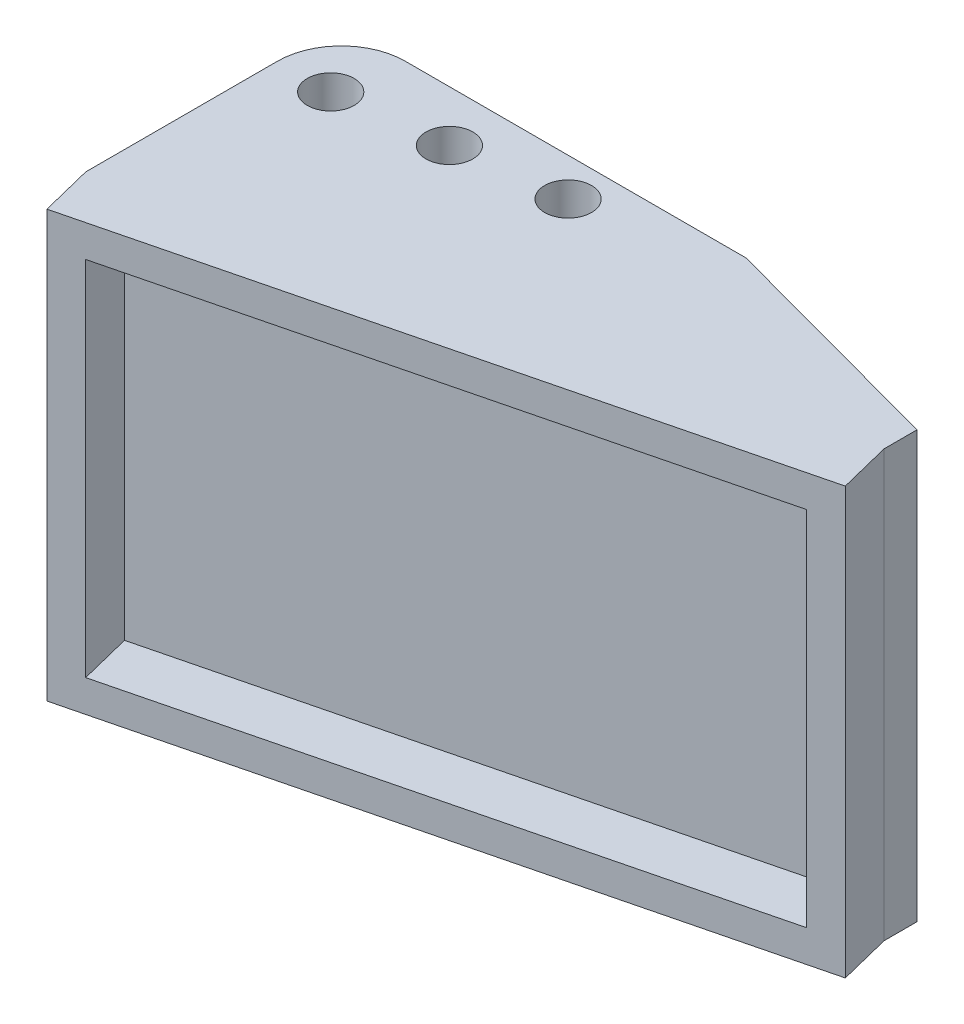
ISO-10303-21;
HEADER;
FILE_DESCRIPTION(('STEP AP214'),'2;1');
FILE_NAME('part.step','',(''),(''),'','','');
FILE_SCHEMA(('AUTOMOTIVE_DESIGN { 1 0 10303 214 1 1 1 1 }'));
ENDSEC;
DATA;
#1=APPLICATION_CONTEXT('core data for automotive mechanical design processes');
#2=APPLICATION_PROTOCOL_DEFINITION('international standard','automotive_design',2000,#1);
#3=PRODUCT_CONTEXT('',#1,'mechanical');
#4=PRODUCT('Part','Part','',(#3));
#5=PRODUCT_RELATED_PRODUCT_CATEGORY('part','',(#4));
#6=PRODUCT_DEFINITION_FORMATION('','',#4);
#7=PRODUCT_DEFINITION_CONTEXT('part definition',#1,'design');
#8=PRODUCT_DEFINITION('design','',#6,#7);
#9=PRODUCT_DEFINITION_SHAPE('','',#8);
#10=(LENGTH_UNIT() NAMED_UNIT(*) SI_UNIT(.MILLI.,.METRE.));
#11=(NAMED_UNIT(*) PLANE_ANGLE_UNIT() SI_UNIT($,.RADIAN.));
#12=(NAMED_UNIT(*) SI_UNIT($,.STERADIAN.) SOLID_ANGLE_UNIT());
#13=UNCERTAINTY_MEASURE_WITH_UNIT(LENGTH_MEASURE(1.E-05),#10,'distance_accuracy_value','');
#14=(GEOMETRIC_REPRESENTATION_CONTEXT(3) GLOBAL_UNCERTAINTY_ASSIGNED_CONTEXT((#13)) GLOBAL_UNIT_ASSIGNED_CONTEXT((#10,
#11,#12)) REPRESENTATION_CONTEXT('',''));
#15=CARTESIAN_POINT('',(0.,0.,0.));
#16=DIRECTION('',(0.,0.,1.));
#17=DIRECTION('',(1.,0.,0.));
#18=AXIS2_PLACEMENT_3D('',#15,#16,#17);
#19=CARTESIAN_POINT('',(-15.,20.,-6.));
#20=DIRECTION('',(0.,0.,1.));
#21=DIRECTION('',(1.,0.,0.));
#22=AXIS2_PLACEMENT_3D('',#19,#20,#21);
#23=PLANE('',#22);
#24=DIRECTION('',(-1.,0.,0.));
#25=VECTOR('',#24,1.);
#26=CARTESIAN_POINT('',(15.,2.45,-6.));
#27=LINE('',#26,#25);
#28=CARTESIAN_POINT('',(4.00000000000001,2.45,-6.));
#29=VERTEX_POINT('',#28);
#30=CARTESIAN_POINT('',(-12.,2.45,-6.));
#31=VERTEX_POINT('',#30);
#32=EDGE_CURVE('E262',#29,#31,#27,.T.);
#33=ORIENTED_EDGE('',*,*,#32,.F.);
#34=DIRECTION('',(0.,1.,0.));
#35=VECTOR('',#34,1.);
#36=CARTESIAN_POINT('',(4.,0.,-6.));
#37=LINE('',#36,#35);
#38=CARTESIAN_POINT('',(4.,0.,-6.));
#39=VERTEX_POINT('',#38);
#40=EDGE_CURVE('E61',#39,#29,#37,.T.);
#41=ORIENTED_EDGE('',*,*,#40,.F.);
#42=DIRECTION('',(-1.,0.,0.));
#43=VECTOR('',#42,1.);
#44=CARTESIAN_POINT('',(-15.,0.,-6.));
#45=LINE('',#44,#43);
#46=CARTESIAN_POINT('',(-12.,0.,-6.));
#47=VERTEX_POINT('',#46);
#48=EDGE_CURVE('E211',#39,#47,#45,.T.);
#49=ORIENTED_EDGE('',*,*,#48,.T.);
#50=DIRECTION('',(0.,-1.,0.));
#51=VECTOR('',#50,1.);
#52=CARTESIAN_POINT('',(-12.,20.,-6.));
#53=LINE('',#52,#51);
#54=EDGE_CURVE('E241',#47,#31,#53,.F.);
#55=ORIENTED_EDGE('',*,*,#54,.T.);
#56=EDGE_LOOP('',(#33,#41,#49,#55));
#57=FACE_BOUND('',#56,.T.);
#58=ADVANCED_FACE('F45',(#57),#23,.F.);
#59=CARTESIAN_POINT('',(-2.57453848358678,0.,-4.21869343405148));
#60=DIRECTION('',(0.,1.,0.));
#61=DIRECTION('',(0.,0.,1.));
#62=AXIS2_PLACEMENT_3D('',#59,#60,#61);
#63=CYLINDRICAL_SURFACE('',#62,1.1);
#64=CARTESIAN_POINT('',(-2.57453848358678,2.45,-4.21869343405148));
#65=DIRECTION('',(0.,-1.,0.));
#66=DIRECTION('',(0.,0.,-1.));
#67=AXIS2_PLACEMENT_3D('',#64,#65,#66);
#68=CIRCLE('',#67,1.1);
#69=CARTESIAN_POINT('',(-2.57453848358678,2.45,-5.31869343405148));
#70=VERTEX_POINT('',#69);
#71=EDGE_CURVE('E278',#70,#70,#68,.F.);
#72=ORIENTED_EDGE('',*,*,#71,.T.);
#73=EDGE_LOOP('',(#72));
#74=FACE_BOUND('',#73,.T.);
#75=CARTESIAN_POINT('',(-2.57453848358678,0.,-4.21869343405148));
#76=DIRECTION('',(0.,1.,0.));
#77=DIRECTION('',(0.,0.,1.));
#78=AXIS2_PLACEMENT_3D('',#75,#76,#77);
#79=CIRCLE('',#78,1.1);
#80=CARTESIAN_POINT('',(-2.57453848358678,0.,-3.11869343405148));
#81=VERTEX_POINT('',#80);
#82=EDGE_CURVE('E273',#81,#81,#79,.T.);
#83=ORIENTED_EDGE('',*,*,#82,.F.);
#84=EDGE_LOOP('',(#83));
#85=FACE_BOUND('',#84,.T.);
#86=ADVANCED_FACE('F444',(#74,#85),#63,.F.);
#87=CARTESIAN_POINT('',(-7.53726924179339,0.,-3.60934671702574));
#88=DIRECTION('',(0.,1.,0.));
#89=DIRECTION('',(0.,0.,1.));
#90=AXIS2_PLACEMENT_3D('',#87,#88,#89);
#91=CYLINDRICAL_SURFACE('',#90,1.1);
#92=CARTESIAN_POINT('',(-7.53726924179339,2.45,-3.60934671702574));
#93=DIRECTION('',(0.,-1.,0.));
#94=DIRECTION('',(0.,0.,-1.));
#95=AXIS2_PLACEMENT_3D('',#92,#93,#94);
#96=CIRCLE('',#95,1.1);
#97=CARTESIAN_POINT('',(-7.53726924179339,2.45,-4.70934671702574));
#98=VERTEX_POINT('',#97);
#99=EDGE_CURVE('E228',#98,#98,#96,.F.);
#100=ORIENTED_EDGE('',*,*,#99,.T.);
#101=EDGE_LOOP('',(#100));
#102=FACE_BOUND('',#101,.T.);
#103=CARTESIAN_POINT('',(-7.53726924179339,0.,-3.60934671702574));
#104=DIRECTION('',(0.,1.,0.));
#105=DIRECTION('',(0.,0.,1.));
#106=AXIS2_PLACEMENT_3D('',#103,#104,#105);
#107=CIRCLE('',#106,1.1);
#108=CARTESIAN_POINT('',(-7.53726924179339,0.,-2.50934671702574));
#109=VERTEX_POINT('',#108);
#110=EDGE_CURVE('E282',#109,#109,#107,.T.);
#111=ORIENTED_EDGE('',*,*,#110,.F.);
#112=EDGE_LOOP('',(#111));
#113=FACE_BOUND('',#112,.T.);
#114=ADVANCED_FACE('F452',(#102,#113),#91,.F.);
#115=CARTESIAN_POINT('',(-12.5,0.,-3.));
#116=DIRECTION('',(0.,1.,0.));
#117=DIRECTION('',(0.,0.,1.));
#118=AXIS2_PLACEMENT_3D('',#115,#116,#117);
#119=CYLINDRICAL_SURFACE('',#118,1.1);
#120=CARTESIAN_POINT('',(-12.5,2.45,-3.));
#121=DIRECTION('',(0.,-1.,0.));
#122=DIRECTION('',(0.,0.,-1.));
#123=AXIS2_PLACEMENT_3D('',#120,#121,#122);
#124=CIRCLE('',#123,1.1);
#125=CARTESIAN_POINT('',(-12.5,2.45,-4.1));
#126=VERTEX_POINT('',#125);
#127=EDGE_CURVE('E224',#126,#126,#124,.F.);
#128=ORIENTED_EDGE('',*,*,#127,.T.);
#129=EDGE_LOOP('',(#128));
#130=FACE_BOUND('',#129,.T.);
#131=CARTESIAN_POINT('',(-12.5,0.,-3.));
#132=DIRECTION('',(0.,1.,0.));
#133=DIRECTION('',(0.,0.,1.));
#134=AXIS2_PLACEMENT_3D('',#131,#132,#133);
#135=CIRCLE('',#134,1.1);
#136=CARTESIAN_POINT('',(-12.5,0.,-1.9));
#137=VERTEX_POINT('',#136);
#138=EDGE_CURVE('E207',#137,#137,#135,.T.);
#139=ORIENTED_EDGE('',*,*,#138,.F.);
#140=EDGE_LOOP('',(#139));
#141=FACE_BOUND('',#140,.T.);
#142=ADVANCED_FACE('F467',(#130,#141),#119,.F.);
#143=CARTESIAN_POINT('',(-15.,20.,-6.));
#144=DIRECTION('',(1.,0.,0.));
#145=DIRECTION('',(0.,0.,-1.));
#146=AXIS2_PLACEMENT_3D('',#143,#144,#145);
#147=PLANE('',#146);
#148=DIRECTION('',(0.,0.,-1.));
#149=VECTOR('',#148,1.);
#150=CARTESIAN_POINT('',(-15.,2.45,34.8141121698799));
#151=LINE('',#150,#149);
#152=CARTESIAN_POINT('',(-15.,2.45,4.45407955597516));
#153=VERTEX_POINT('',#152);
#154=CARTESIAN_POINT('',(-15.,2.45,-3.));
#155=VERTEX_POINT('',#154);
#156=EDGE_CURVE('E309',#153,#155,#151,.T.);
#157=ORIENTED_EDGE('',*,*,#156,.T.);
#158=DIRECTION('',(0.,-1.,0.));
#159=VECTOR('',#158,1.);
#160=CARTESIAN_POINT('',(-15.,20.,-3.));
#161=LINE('',#160,#159);
#162=CARTESIAN_POINT('',(-15.,0.,-3.));
#163=VERTEX_POINT('',#162);
#164=EDGE_CURVE('E233',#155,#163,#161,.T.);
#165=ORIENTED_EDGE('',*,*,#164,.T.);
#166=DIRECTION('',(0.,0.,1.));
#167=VECTOR('',#166,1.);
#168=CARTESIAN_POINT('',(-15.,0.,-6.));
#169=LINE('',#168,#167);
#170=CARTESIAN_POINT('',(-15.,0.,6.));
#171=VERTEX_POINT('',#170);
#172=EDGE_CURVE('E203',#163,#171,#169,.T.);
#173=ORIENTED_EDGE('',*,*,#172,.T.);
#174=DIRECTION('',(0.,-1.,0.));
#175=VECTOR('',#174,1.);
#176=CARTESIAN_POINT('',(-15.,20.,6.));
#177=LINE('',#176,#175);
#178=CARTESIAN_POINT('',(-15.,20.,6.));
#179=VERTEX_POINT('',#178);
#180=EDGE_CURVE('E197',#179,#171,#177,.T.);
#181=ORIENTED_EDGE('',*,*,#180,.F.);
#182=DIRECTION('',(0.,0.,1.));
#183=VECTOR('',#182,1.);
#184=CARTESIAN_POINT('',(-15.,20.,-6.));
#185=LINE('',#184,#183);
#186=CARTESIAN_POINT('',(-15.,20.,-3.));
#187=VERTEX_POINT('',#186);
#188=EDGE_CURVE('E199',#187,#179,#185,.T.);
#189=ORIENTED_EDGE('',*,*,#188,.F.);
#190=DIRECTION('',(0.,-1.,0.));
#191=VECTOR('',#190,1.);
#192=CARTESIAN_POINT('',(-15.,20.,-3.));
#193=LINE('',#192,#191);
#194=CARTESIAN_POINT('',(-15.,17.55,-3.));
#195=VERTEX_POINT('',#194);
#196=EDGE_CURVE('E217',#187,#195,#193,.T.);
#197=ORIENTED_EDGE('',*,*,#196,.T.);
#198=DIRECTION('',(0.,0.,-1.));
#199=VECTOR('',#198,1.);
#200=CARTESIAN_POINT('',(-15.,17.55,34.8141121698799));
#201=LINE('',#200,#199);
#202=CARTESIAN_POINT('',(-15.,17.55,4.45407955597516));
#203=VERTEX_POINT('',#202);
#204=EDGE_CURVE('E257',#203,#195,#201,.T.);
#205=ORIENTED_EDGE('',*,*,#204,.F.);
#206=DIRECTION('',(0.,1.,0.));
#207=VECTOR('',#206,1.);
#208=CARTESIAN_POINT('',(-15.,17.55,4.45407955597516));
#209=LINE('',#208,#207);
#210=EDGE_CURVE('E312',#153,#203,#209,.T.);
#211=ORIENTED_EDGE('',*,*,#210,.F.);
#212=EDGE_LOOP('',(#157,#165,#173,#181,#189,#197,#205,#211));
#213=FACE_BOUND('',#212,.T.);
#214=ADVANCED_FACE('F269',(#213),#147,.F.);
#215=CARTESIAN_POINT('',(15.,20.,-6.));
#216=DIRECTION('',(-1.,0.,0.));
#217=DIRECTION('',(0.,0.,1.));
#218=AXIS2_PLACEMENT_3D('',#215,#216,#217);
#219=PLANE('',#218);
#220=DIRECTION('',(0.,0.,-1.));
#221=VECTOR('',#220,1.);
#222=CARTESIAN_POINT('',(15.,0.,-6.));
#223=LINE('',#222,#221);
#224=CARTESIAN_POINT('',(15.,0.,-1.47984008529545));
#225=VERTEX_POINT('',#224);
#226=CARTESIAN_POINT('',(15.,0.,-3.0257605293203));
#227=VERTEX_POINT('',#226);
#228=EDGE_CURVE('E206',#225,#227,#223,.T.);
#229=ORIENTED_EDGE('',*,*,#228,.T.);
#230=DIRECTION('',(0.,1.,0.));
#231=VECTOR('',#230,1.);
#232=CARTESIAN_POINT('',(15.,0.,-3.0257605293203));
#233=LINE('',#232,#231);
#234=CARTESIAN_POINT('',(15.,2.45,-3.0257605293203));
#235=VERTEX_POINT('',#234);
#236=EDGE_CURVE('E402',#227,#235,#233,.T.);
#237=ORIENTED_EDGE('',*,*,#236,.T.);
#238=DIRECTION('',(0.,-1.,0.));
#239=VECTOR('',#238,1.);
#240=CARTESIAN_POINT('',(15.,17.55,-3.02576052932029));
#241=LINE('',#240,#239);
#242=CARTESIAN_POINT('',(15.,17.55,-3.0257605293203));
#243=VERTEX_POINT('',#242);
#244=EDGE_CURVE('E223',#243,#235,#241,.T.);
#245=ORIENTED_EDGE('',*,*,#244,.F.);
#246=CARTESIAN_POINT('',(15.,20.,-3.0257605293203));
#247=VERTEX_POINT('',#246);
#248=EDGE_CURVE('E405',#243,#247,#233,.T.);
#249=ORIENTED_EDGE('',*,*,#248,.T.);
#250=DIRECTION('',(0.,0.,-1.));
#251=VECTOR('',#250,1.);
#252=CARTESIAN_POINT('',(15.,20.,-6.));
#253=LINE('',#252,#251);
#254=CARTESIAN_POINT('',(15.,20.,-1.47984008529545));
#255=VERTEX_POINT('',#254);
#256=EDGE_CURVE('E185',#255,#247,#253,.T.);
#257=ORIENTED_EDGE('',*,*,#256,.F.);
#258=DIRECTION('',(0.,-1.,0.));
#259=VECTOR('',#258,1.);
#260=CARTESIAN_POINT('',(15.,20.,-1.47984008529545));
#261=LINE('',#260,#259);
#262=EDGE_CURVE('E192',#255,#225,#261,.T.);
#263=ORIENTED_EDGE('',*,*,#262,.T.);
#264=EDGE_LOOP('',(#229,#237,#245,#249,#257,#263));
#265=FACE_BOUND('',#264,.T.);
#266=ADVANCED_FACE('F416',(#265),#219,.F.);
#267=DIRECTION('',(-1.,0.,0.));
#268=VECTOR('',#267,1.);
#269=CARTESIAN_POINT('',(-15.,20.,-6.));
#270=LINE('',#269,#268);
#271=CARTESIAN_POINT('',(4.,20.,-6.));
#272=VERTEX_POINT('',#271);
#273=CARTESIAN_POINT('',(-12.,20.,-6.));
#274=VERTEX_POINT('',#273);
#275=EDGE_CURVE('E182',#272,#274,#270,.T.);
#276=ORIENTED_EDGE('',*,*,#275,.F.);
#277=CARTESIAN_POINT('',(4.,17.55,-6.));
#278=VERTEX_POINT('',#277);
#279=EDGE_CURVE('E164',#278,#272,#37,.T.);
#280=ORIENTED_EDGE('',*,*,#279,.F.);
#281=DIRECTION('',(1.,0.,0.));
#282=VECTOR('',#281,1.);
#283=CARTESIAN_POINT('',(15.,17.55,-6.));
#284=LINE('',#283,#282);
#285=CARTESIAN_POINT('',(-12.,17.55,-6.));
#286=VERTEX_POINT('',#285);
#287=EDGE_CURVE('E255',#286,#278,#284,.T.);
#288=ORIENTED_EDGE('',*,*,#287,.F.);
#289=DIRECTION('',(0.,-1.,0.));
#290=VECTOR('',#289,1.);
#291=CARTESIAN_POINT('',(-12.,20.,-6.));
#292=LINE('',#291,#290);
#293=EDGE_CURVE('E54',#286,#274,#292,.F.);
#294=ORIENTED_EDGE('',*,*,#293,.T.);
#295=EDGE_LOOP('',(#276,#280,#288,#294));
#296=FACE_BOUND('',#295,.T.);
#297=ADVANCED_FACE('F188',(#296),#23,.F.);
#298=CARTESIAN_POINT('',(0.,20.,0.));
#299=DIRECTION('',(0.,1.,0.));
#300=DIRECTION('',(0.,0.,1.));
#301=AXIS2_PLACEMENT_3D('',#298,#299,#300);
#302=PLANE('',#301);
#303=DIRECTION('',(0.965335393154224,0.,0.261012602614855));
#304=VECTOR('',#303,1.);
#305=CARTESIAN_POINT('',(15.,20.,-3.0257605293203));
#306=LINE('',#305,#304);
#307=EDGE_CURVE('E167',#272,#247,#306,.T.);
#308=ORIENTED_EDGE('',*,*,#307,.F.);
#309=ORIENTED_EDGE('',*,*,#275,.T.);
#310=CARTESIAN_POINT('',(-12.,20.,-3.));
#311=DIRECTION('',(0.,1.,0.));
#312=DIRECTION('',(0.,0.,1.));
#313=AXIS2_PLACEMENT_3D('',#310,#311,#312);
#314=CIRCLE('',#313,3.);
#315=EDGE_CURVE('E11',#274,#187,#314,.T.);
#316=ORIENTED_EDGE('',*,*,#315,.T.);
#317=ORIENTED_EDGE('',*,*,#188,.T.);
#318=DIRECTION('',(-0.241921895599669,0.,-0.970295726275996));
#319=VECTOR('',#318,1.);
#320=CARTESIAN_POINT('',(-14.3951952610008,20.,8.42573931568999));
#321=LINE('',#320,#319);
#322=CARTESIAN_POINT('',(-14.3951952610008,20.,8.42573931568999));
#323=VERTEX_POINT('',#322);
#324=EDGE_CURVE('E341',#323,#179,#321,.T.);
#325=ORIENTED_EDGE('',*,*,#324,.F.);
#326=DIRECTION('',(-0.970295726275996,0.,0.241921895599669));
#327=VECTOR('',#326,1.);
#328=CARTESIAN_POINT('',(-14.3951952610008,20.,8.42573931568999));
#329=LINE('',#328,#327);
#330=CARTESIAN_POINT('',(15.6048047389992,20.,0.94589923039454));
#331=VERTEX_POINT('',#330);
#332=EDGE_CURVE('E344',#331,#323,#329,.T.);
#333=ORIENTED_EDGE('',*,*,#332,.F.);
#334=DIRECTION('',(-0.241921895599669,0.,-0.970295726275996));
#335=VECTOR('',#334,1.);
#336=CARTESIAN_POINT('',(15.6048047389992,20.,0.94589923039454));
#337=LINE('',#336,#335);
#338=EDGE_CURVE('E338',#331,#255,#337,.T.);
#339=ORIENTED_EDGE('',*,*,#338,.T.);
#340=ORIENTED_EDGE('',*,*,#256,.T.);
#341=EDGE_LOOP('',(#308,#309,#316,#317,#325,#333,#339,#340));
#342=FACE_BOUND('',#341,.T.);
#343=CARTESIAN_POINT('',(-12.5,20.,-3.));
#344=DIRECTION('',(0.,1.,0.));
#345=DIRECTION('',(0.,0.,1.));
#346=AXIS2_PLACEMENT_3D('',#343,#344,#345);
#347=CIRCLE('',#346,1.1);
#348=CARTESIAN_POINT('',(-12.5,20.,-1.9));
#349=VERTEX_POINT('',#348);
#350=EDGE_CURVE('E290',#349,#349,#347,.T.);
#351=ORIENTED_EDGE('',*,*,#350,.F.);
#352=EDGE_LOOP('',(#351));
#353=FACE_BOUND('',#352,.T.);
#354=CARTESIAN_POINT('',(-7.53726924179339,20.,-3.60934671702574));
#355=DIRECTION('',(0.,1.,0.));
#356=DIRECTION('',(0.,0.,1.));
#357=AXIS2_PLACEMENT_3D('',#354,#355,#356);
#358=CIRCLE('',#357,1.1);
#359=CARTESIAN_POINT('',(-7.53726924179339,20.,-2.50934671702574));
#360=VERTEX_POINT('',#359);
#361=EDGE_CURVE('E286',#360,#360,#358,.T.);
#362=ORIENTED_EDGE('',*,*,#361,.F.);
#363=EDGE_LOOP('',(#362));
#364=FACE_BOUND('',#363,.T.);
#365=CARTESIAN_POINT('',(-2.57453848358678,20.,-4.21869343405148));
#366=DIRECTION('',(0.,1.,0.));
#367=DIRECTION('',(0.,0.,1.));
#368=AXIS2_PLACEMENT_3D('',#365,#366,#367);
#369=CIRCLE('',#368,1.1);
#370=CARTESIAN_POINT('',(-2.57453848358678,20.,-3.11869343405148));
#371=VERTEX_POINT('',#370);
#372=EDGE_CURVE('E277',#371,#371,#369,.T.);
#373=ORIENTED_EDGE('',*,*,#372,.F.);
#374=EDGE_LOOP('',(#373));
#375=FACE_BOUND('',#374,.T.);
#376=ADVANCED_FACE('F180',(#342,#353,#364,#375),#302,.T.);
#377=CARTESIAN_POINT('',(0.,0.,0.));
#378=DIRECTION('',(0.,1.,0.));
#379=DIRECTION('',(0.,0.,1.));
#380=AXIS2_PLACEMENT_3D('',#377,#378,#379);
#381=PLANE('',#380);
#382=ORIENTED_EDGE('',*,*,#138,.T.);
#383=EDGE_LOOP('',(#382));
#384=FACE_BOUND('',#383,.T.);
#385=ORIENTED_EDGE('',*,*,#110,.T.);
#386=EDGE_LOOP('',(#385));
#387=FACE_BOUND('',#386,.T.);
#388=ORIENTED_EDGE('',*,*,#82,.T.);
#389=EDGE_LOOP('',(#388));
#390=FACE_BOUND('',#389,.T.);
#391=ORIENTED_EDGE('',*,*,#48,.F.);
#392=DIRECTION('',(0.965335393154224,0.,0.261012602614855));
#393=VECTOR('',#392,1.);
#394=CARTESIAN_POINT('',(15.,0.,-3.0257605293203));
#395=LINE('',#394,#393);
#396=EDGE_CURVE('E176',#39,#227,#395,.T.);
#397=ORIENTED_EDGE('',*,*,#396,.T.);
#398=ORIENTED_EDGE('',*,*,#228,.F.);
#399=DIRECTION('',(-0.241921895599669,0.,-0.970295726275996));
#400=VECTOR('',#399,1.);
#401=CARTESIAN_POINT('',(15.6048047389992,0.,0.94589923039454));
#402=LINE('',#401,#400);
#403=CARTESIAN_POINT('',(15.6048047389992,0.,0.94589923039454));
#404=VERTEX_POINT('',#403);
#405=EDGE_CURVE('E334',#404,#225,#402,.T.);
#406=ORIENTED_EDGE('',*,*,#405,.F.);
#407=DIRECTION('',(0.970295726275996,0.,-0.241921895599669));
#408=VECTOR('',#407,1.);
#409=CARTESIAN_POINT('',(-14.3951952610008,0.,8.42573931568999));
#410=LINE('',#409,#408);
#411=CARTESIAN_POINT('',(-14.3951952610008,0.,8.42573931568999));
#412=VERTEX_POINT('',#411);
#413=EDGE_CURVE('E350',#412,#404,#410,.T.);
#414=ORIENTED_EDGE('',*,*,#413,.F.);
#415=DIRECTION('',(-0.241921895599669,0.,-0.970295726275996));
#416=VECTOR('',#415,1.);
#417=CARTESIAN_POINT('',(-14.3951952610008,0.,8.42573931568999));
#418=LINE('',#417,#416);
#419=EDGE_CURVE('E329',#412,#171,#418,.T.);
#420=ORIENTED_EDGE('',*,*,#419,.T.);
#421=ORIENTED_EDGE('',*,*,#172,.F.);
#422=CARTESIAN_POINT('',(-12.,0.,-3.));
#423=DIRECTION('',(0.,1.,0.));
#424=DIRECTION('',(0.,0.,1.));
#425=AXIS2_PLACEMENT_3D('',#422,#423,#424);
#426=CIRCLE('',#425,3.);
#427=EDGE_CURVE('E237',#163,#47,#426,.F.);
#428=ORIENTED_EDGE('',*,*,#427,.T.);
#429=EDGE_LOOP('',(#391,#397,#398,#406,#414,#420,#421,#428));
#430=FACE_BOUND('',#429,.T.);
#431=ADVANCED_FACE('F413',(#384,#387,#390,#430),#381,.F.);
#432=CARTESIAN_POINT('',(-2.57453848358678,17.55,-4.21869343405148));
#433=DIRECTION('',(0.,1.,0.));
#434=DIRECTION('',(0.,0.,1.));
#435=AXIS2_PLACEMENT_3D('',#432,#433,#434);
#436=CIRCLE('',#435,1.1);
#437=CARTESIAN_POINT('',(-2.57453848358678,17.55,-3.11869343405148));
#438=VERTEX_POINT('',#437);
#439=EDGE_CURVE('E229',#438,#438,#436,.F.);
#440=ORIENTED_EDGE('',*,*,#439,.T.);
#441=EDGE_LOOP('',(#440));
#442=FACE_BOUND('',#441,.T.);
#443=ORIENTED_EDGE('',*,*,#372,.T.);
#444=EDGE_LOOP('',(#443));
#445=FACE_BOUND('',#444,.T.);
#446=ADVANCED_FACE('F455',(#442,#445),#63,.F.);
#447=CARTESIAN_POINT('',(-7.53726924179339,17.55,-3.60934671702574));
#448=DIRECTION('',(0.,1.,0.));
#449=DIRECTION('',(0.,0.,1.));
#450=AXIS2_PLACEMENT_3D('',#447,#448,#449);
#451=CIRCLE('',#450,1.1);
#452=CARTESIAN_POINT('',(-7.53726924179339,17.55,-2.50934671702574));
#453=VERTEX_POINT('',#452);
#454=EDGE_CURVE('E222',#453,#453,#451,.F.);
#455=ORIENTED_EDGE('',*,*,#454,.T.);
#456=EDGE_LOOP('',(#455));
#457=FACE_BOUND('',#456,.T.);
#458=ORIENTED_EDGE('',*,*,#361,.T.);
#459=EDGE_LOOP('',(#458));
#460=FACE_BOUND('',#459,.T.);
#461=ADVANCED_FACE('F584',(#457,#460),#91,.F.);
#462=CARTESIAN_POINT('',(-12.5,17.55,-3.));
#463=DIRECTION('',(0.,1.,0.));
#464=DIRECTION('',(0.,0.,1.));
#465=AXIS2_PLACEMENT_3D('',#462,#463,#464);
#466=CIRCLE('',#465,1.1);
#467=CARTESIAN_POINT('',(-12.5,17.55,-1.9));
#468=VERTEX_POINT('',#467);
#469=EDGE_CURVE('E218',#468,#468,#466,.F.);
#470=ORIENTED_EDGE('',*,*,#469,.T.);
#471=EDGE_LOOP('',(#470));
#472=FACE_BOUND('',#471,.T.);
#473=ORIENTED_EDGE('',*,*,#350,.T.);
#474=EDGE_LOOP('',(#473));
#475=FACE_BOUND('',#474,.T.);
#476=ADVANCED_FACE('F594',(#472,#475),#119,.F.);
#477=CARTESIAN_POINT('',(15.,2.45,34.8141121698799));
#478=DIRECTION('',(0.,-1.,0.));
#479=DIRECTION('',(0.,0.,-1.));
#480=AXIS2_PLACEMENT_3D('',#477,#478,#479);
#481=PLANE('',#480);
#482=ORIENTED_EDGE('',*,*,#99,.F.);
#483=EDGE_LOOP('',(#482));
#484=FACE_BOUND('',#483,.T.);
#485=DIRECTION('',(-0.970295726275996,0.,0.241921895599669));
#486=VECTOR('',#485,1.);
#487=CARTESIAN_POINT('',(6.11762791414362,2.45,-0.811136436643697));
#488=LINE('',#487,#486);
#489=EDGE_CURVE('E261',#235,#153,#488,.T.);
#490=ORIENTED_EDGE('',*,*,#489,.F.);
#491=DIRECTION('',(-0.965335393154224,0.,-0.261012602614855));
#492=VECTOR('',#491,1.);
#493=CARTESIAN_POINT('',(24.5343122999635,2.45,-0.447821623107719));
#494=LINE('',#493,#492);
#495=EDGE_CURVE('E387',#235,#29,#494,.T.);
#496=ORIENTED_EDGE('',*,*,#495,.T.);
#497=ORIENTED_EDGE('',*,*,#32,.T.);
#498=CARTESIAN_POINT('',(-12.,2.45,-3.));
#499=DIRECTION('',(0.,-1.,0.));
#500=DIRECTION('',(0.,0.,-1.));
#501=AXIS2_PLACEMENT_3D('',#498,#499,#500);
#502=CIRCLE('',#501,3.);
#503=EDGE_CURVE('E245',#31,#155,#502,.F.);
#504=ORIENTED_EDGE('',*,*,#503,.T.);
#505=ORIENTED_EDGE('',*,*,#156,.F.);
#506=EDGE_LOOP('',(#490,#496,#497,#504,#505));
#507=FACE_BOUND('',#506,.T.);
#508=ORIENTED_EDGE('',*,*,#127,.F.);
#509=EDGE_LOOP('',(#508));
#510=FACE_BOUND('',#509,.T.);
#511=ORIENTED_EDGE('',*,*,#71,.F.);
#512=EDGE_LOOP('',(#511));
#513=FACE_BOUND('',#512,.T.);
#514=ADVANCED_FACE('F488',(#484,#507,#510,#513),#481,.F.);
#515=CARTESIAN_POINT('',(15.,17.55,34.8141121698799));
#516=DIRECTION('',(0.,1.,0.));
#517=DIRECTION('',(0.,0.,1.));
#518=AXIS2_PLACEMENT_3D('',#515,#516,#517);
#519=PLANE('',#518);
#520=ORIENTED_EDGE('',*,*,#454,.F.);
#521=EDGE_LOOP('',(#520));
#522=FACE_BOUND('',#521,.T.);
#523=ORIENTED_EDGE('',*,*,#287,.T.);
#524=DIRECTION('',(0.965335393154224,0.,0.261012602614855));
#525=VECTOR('',#524,1.);
#526=CARTESIAN_POINT('',(24.5343122999635,17.55,-0.447821623107719));
#527=LINE('',#526,#525);
#528=EDGE_CURVE('E170',#278,#243,#527,.T.);
#529=ORIENTED_EDGE('',*,*,#528,.T.);
#530=DIRECTION('',(0.970295726275996,0.,-0.241921895599669));
#531=VECTOR('',#530,1.);
#532=CARTESIAN_POINT('',(6.11762791414362,17.55,-0.811136436643697));
#533=LINE('',#532,#531);
#534=EDGE_CURVE('E315',#203,#243,#533,.T.);
#535=ORIENTED_EDGE('',*,*,#534,.F.);
#536=ORIENTED_EDGE('',*,*,#204,.T.);
#537=CARTESIAN_POINT('',(-12.,17.55,-3.));
#538=DIRECTION('',(0.,1.,0.));
#539=DIRECTION('',(0.,0.,1.));
#540=AXIS2_PLACEMENT_3D('',#537,#538,#539);
#541=CIRCLE('',#540,3.);
#542=EDGE_CURVE('E248',#195,#286,#541,.F.);
#543=ORIENTED_EDGE('',*,*,#542,.T.);
#544=EDGE_LOOP('',(#523,#529,#535,#536,#543));
#545=FACE_BOUND('',#544,.T.);
#546=ORIENTED_EDGE('',*,*,#469,.F.);
#547=EDGE_LOOP('',(#546));
#548=FACE_BOUND('',#547,.T.);
#549=ORIENTED_EDGE('',*,*,#439,.F.);
#550=EDGE_LOOP('',(#549));
#551=FACE_BOUND('',#550,.T.);
#552=ADVANCED_FACE('F253',(#522,#545,#548,#551),#519,.F.);
#553=CARTESIAN_POINT('',(0.16763879140012,0.,0.672362468268591));
#554=DIRECTION('',(0.241921895599669,0.,0.970295726275996));
#555=DIRECTION('',(0.970295726275996,0.,-0.241921895599669));
#556=AXIS2_PLACEMENT_3D('',#553,#554,#555);
#557=PLANE('',#556);
#558=ORIENTED_EDGE('',*,*,#244,.T.);
#559=ORIENTED_EDGE('',*,*,#489,.T.);
#560=ORIENTED_EDGE('',*,*,#210,.T.);
#561=ORIENTED_EDGE('',*,*,#534,.T.);
#562=EDGE_LOOP('',(#558,#559,#560,#561));
#563=FACE_BOUND('',#562,.T.);
#564=ADVANCED_FACE('F475',(#563),#557,.F.);
#565=CARTESIAN_POINT('',(-12.,20.,-3.));
#566=DIRECTION('',(0.,-1.,0.));
#567=DIRECTION('',(0.,0.,-1.));
#568=AXIS2_PLACEMENT_3D('',#565,#566,#567);
#569=CYLINDRICAL_SURFACE('',#568,3.);
#570=ORIENTED_EDGE('',*,*,#503,.F.);
#571=ORIENTED_EDGE('',*,*,#54,.F.);
#572=ORIENTED_EDGE('',*,*,#427,.F.);
#573=ORIENTED_EDGE('',*,*,#164,.F.);
#574=EDGE_LOOP('',(#570,#571,#572,#573));
#575=FACE_BOUND('',#574,.T.);
#576=ADVANCED_FACE('F473',(#575),#569,.T.);
#577=CARTESIAN_POINT('',(-12.,20.,-3.));
#578=DIRECTION('',(0.,-1.,0.));
#579=DIRECTION('',(0.,0.,-1.));
#580=AXIS2_PLACEMENT_3D('',#577,#578,#579);
#581=CYLINDRICAL_SURFACE('',#580,3.);
#582=ORIENTED_EDGE('',*,*,#315,.F.);
#583=ORIENTED_EDGE('',*,*,#293,.F.);
#584=ORIENTED_EDGE('',*,*,#542,.F.);
#585=ORIENTED_EDGE('',*,*,#196,.F.);
#586=EDGE_LOOP('',(#582,#583,#584,#585));
#587=FACE_BOUND('',#586,.T.);
#588=ADVANCED_FACE('F47',(#587),#581,.T.);
#589=CARTESIAN_POINT('',(1.13532637379879,0.,4.55354537337258));
#590=DIRECTION('',(0.241921895599669,0.,0.970295726275996));
#591=DIRECTION('',(0.970295726275996,0.,-0.241921895599669));
#592=AXIS2_PLACEMENT_3D('',#589,#590,#591);
#593=PLANE('',#592);
#594=DIRECTION('',(0.,-1.,0.));
#595=VECTOR('',#594,1.);
#596=CARTESIAN_POINT('',(-14.3951952610008,20.,8.42573931568999));
#597=LINE('',#596,#595);
#598=EDGE_CURVE('E353',#323,#412,#597,.T.);
#599=ORIENTED_EDGE('',*,*,#598,.T.);
#600=ORIENTED_EDGE('',*,*,#413,.T.);
#601=DIRECTION('',(0.,1.,0.));
#602=VECTOR('',#601,1.);
#603=CARTESIAN_POINT('',(15.6048047389992,20.,0.94589923039454));
#604=LINE('',#603,#602);
#605=EDGE_CURVE('E347',#404,#331,#604,.T.);
#606=ORIENTED_EDGE('',*,*,#605,.T.);
#607=ORIENTED_EDGE('',*,*,#332,.T.);
#608=EDGE_LOOP('',(#599,#600,#606,#607));
#609=FACE_BOUND('',#608,.T.);
#610=DIRECTION('',(0.,-1.,0.));
#611=VECTOR('',#610,1.);
#612=CARTESIAN_POINT('',(-12.9397516715868,18.5,8.06285647229049));
#613=LINE('',#612,#611);
#614=CARTESIAN_POINT('',(-12.9397516715868,18.5,8.06285647229049));
#615=VERTEX_POINT('',#614);
#616=CARTESIAN_POINT('',(-12.9397516715868,1.5,8.06285647229049));
#617=VERTEX_POINT('',#616);
#618=EDGE_CURVE('E394',#615,#617,#613,.T.);
#619=ORIENTED_EDGE('',*,*,#618,.F.);
#620=DIRECTION('',(-0.970295726275996,0.,0.241921895599669));
#621=VECTOR('',#620,1.);
#622=CARTESIAN_POINT('',(14.1493611495852,18.5,1.30878207379404));
#623=LINE('',#622,#621);
#624=CARTESIAN_POINT('',(14.1493611495852,18.5,1.30878207379404));
#625=VERTEX_POINT('',#624);
#626=EDGE_CURVE('E374',#625,#615,#623,.T.);
#627=ORIENTED_EDGE('',*,*,#626,.F.);
#628=DIRECTION('',(0.,1.,0.));
#629=VECTOR('',#628,1.);
#630=CARTESIAN_POINT('',(14.1493611495852,1.5,1.30878207379404));
#631=LINE('',#630,#629);
#632=CARTESIAN_POINT('',(14.1493611495852,1.5,1.30878207379404));
#633=VERTEX_POINT('',#632);
#634=EDGE_CURVE('E369',#633,#625,#631,.T.);
#635=ORIENTED_EDGE('',*,*,#634,.F.);
#636=DIRECTION('',(0.970295726275996,0.,-0.241921895599669));
#637=VECTOR('',#636,1.);
#638=CARTESIAN_POINT('',(-12.9397516715868,1.5,8.06285647229049));
#639=LINE('',#638,#637);
#640=EDGE_CURVE('E390',#617,#633,#639,.T.);
#641=ORIENTED_EDGE('',*,*,#640,.F.);
#642=EDGE_LOOP('',(#619,#627,#635,#641));
#643=FACE_BOUND('',#642,.T.);
#644=ADVANCED_FACE('F428',(#609,#643),#593,.T.);
#645=CARTESIAN_POINT('',(-14.3951952610008,20.,8.42573931568999));
#646=DIRECTION('',(0.970295726275996,0.,-0.241921895599669));
#647=DIRECTION('',(-0.241921895599669,0.,-0.970295726275996));
#648=AXIS2_PLACEMENT_3D('',#645,#646,#647);
#649=PLANE('',#648);
#650=ORIENTED_EDGE('',*,*,#180,.T.);
#651=ORIENTED_EDGE('',*,*,#419,.F.);
#652=ORIENTED_EDGE('',*,*,#598,.F.);
#653=ORIENTED_EDGE('',*,*,#324,.T.);
#654=EDGE_LOOP('',(#650,#651,#652,#653));
#655=FACE_BOUND('',#654,.T.);
#656=ADVANCED_FACE('F432',(#655),#649,.F.);
#657=CARTESIAN_POINT('',(15.6048047389992,20.,0.94589923039454));
#658=DIRECTION('',(-0.970295726275996,0.,0.241921895599669));
#659=DIRECTION('',(0.241921895599669,0.,0.970295726275996));
#660=AXIS2_PLACEMENT_3D('',#657,#658,#659);
#661=PLANE('',#660);
#662=ORIENTED_EDGE('',*,*,#262,.F.);
#663=ORIENTED_EDGE('',*,*,#338,.F.);
#664=ORIENTED_EDGE('',*,*,#605,.F.);
#665=ORIENTED_EDGE('',*,*,#405,.T.);
#666=EDGE_LOOP('',(#662,#663,#664,#665));
#667=FACE_BOUND('',#666,.T.);
#668=ADVANCED_FACE('F423',(#667),#661,.F.);
#669=CARTESIAN_POINT('',(14.1493611495852,18.5,1.30878207379404));
#670=DIRECTION('',(0.,-1.,0.));
#671=DIRECTION('',(1.,0.,0.));
#672=AXIS2_PLACEMENT_3D('',#669,#670,#671);
#673=PLANE('',#672);
#674=DIRECTION('',(-0.970295726275996,0.,0.241921895599669));
#675=VECTOR('',#674,1.);
#676=CARTESIAN_POINT('',(13.544556410586,18.5,-1.11695724189595));
#677=LINE('',#676,#675);
#678=CARTESIAN_POINT('',(13.544556410586,18.5,-1.11695724189595));
#679=VERTEX_POINT('',#678);
#680=CARTESIAN_POINT('',(-13.544556410586,18.5,5.6371171566005));
#681=VERTEX_POINT('',#680);
#682=EDGE_CURVE('E383',#679,#681,#677,.T.);
#683=ORIENTED_EDGE('',*,*,#682,.F.);
#684=DIRECTION('',(-0.241921895599669,0.,-0.970295726275996));
#685=VECTOR('',#684,1.);
#686=CARTESIAN_POINT('',(14.1493611495852,18.5,1.30878207379404));
#687=LINE('',#686,#685);
#688=EDGE_CURVE('E69',#625,#679,#687,.T.);
#689=ORIENTED_EDGE('',*,*,#688,.F.);
#690=ORIENTED_EDGE('',*,*,#626,.T.);
#691=DIRECTION('',(-0.241921895599669,0.,-0.970295726275996));
#692=VECTOR('',#691,1.);
#693=CARTESIAN_POINT('',(-12.9397516715868,18.5,8.06285647229049));
#694=LINE('',#693,#692);
#695=EDGE_CURVE('E357',#615,#681,#694,.T.);
#696=ORIENTED_EDGE('',*,*,#695,.T.);
#697=EDGE_LOOP('',(#683,#689,#690,#696));
#698=FACE_BOUND('',#697,.T.);
#699=ADVANCED_FACE('F439',(#698),#673,.T.);
#700=CARTESIAN_POINT('',(-12.9397516715868,18.5,8.06285647229049));
#701=DIRECTION('',(0.970295726275996,0.,-0.241921895599669));
#702=DIRECTION('',(-0.241921895599669,0.,-0.970295726275996));
#703=AXIS2_PLACEMENT_3D('',#700,#701,#702);
#704=PLANE('',#703);
#705=DIRECTION('',(0.,-1.,0.));
#706=VECTOR('',#705,1.);
#707=CARTESIAN_POINT('',(-13.544556410586,18.5,5.6371171566005));
#708=LINE('',#707,#706);
#709=CARTESIAN_POINT('',(-13.544556410586,1.5,5.6371171566005));
#710=VERTEX_POINT('',#709);
#711=EDGE_CURVE('E379',#681,#710,#708,.T.);
#712=ORIENTED_EDGE('',*,*,#711,.F.);
#713=ORIENTED_EDGE('',*,*,#695,.F.);
#714=ORIENTED_EDGE('',*,*,#618,.T.);
#715=DIRECTION('',(-0.241921895599669,0.,-0.970295726275996));
#716=VECTOR('',#715,1.);
#717=CARTESIAN_POINT('',(-12.9397516715868,1.5,8.06285647229049));
#718=LINE('',#717,#716);
#719=EDGE_CURVE('E361',#617,#710,#718,.T.);
#720=ORIENTED_EDGE('',*,*,#719,.T.);
#721=EDGE_LOOP('',(#712,#713,#714,#720));
#722=FACE_BOUND('',#721,.T.);
#723=ADVANCED_FACE('F503',(#722),#704,.T.);
#724=CARTESIAN_POINT('',(-12.9397516715868,1.5,8.06285647229049));
#725=DIRECTION('',(0.,1.,0.));
#726=DIRECTION('',(0.,0.,1.));
#727=AXIS2_PLACEMENT_3D('',#724,#725,#726);
#728=PLANE('',#727);
#729=DIRECTION('',(0.970295726275996,0.,-0.241921895599669));
#730=VECTOR('',#729,1.);
#731=CARTESIAN_POINT('',(-13.544556410586,1.5,5.6371171566005));
#732=LINE('',#731,#730);
#733=CARTESIAN_POINT('',(13.544556410586,1.5,-1.11695724189595));
#734=VERTEX_POINT('',#733);
#735=EDGE_CURVE('E375',#710,#734,#732,.T.);
#736=ORIENTED_EDGE('',*,*,#735,.F.);
#737=ORIENTED_EDGE('',*,*,#719,.F.);
#738=ORIENTED_EDGE('',*,*,#640,.T.);
#739=DIRECTION('',(-0.241921895599669,0.,-0.970295726275996));
#740=VECTOR('',#739,1.);
#741=CARTESIAN_POINT('',(14.1493611495852,1.5,1.30878207379404));
#742=LINE('',#741,#740);
#743=EDGE_CURVE('E364',#633,#734,#742,.T.);
#744=ORIENTED_EDGE('',*,*,#743,.T.);
#745=EDGE_LOOP('',(#736,#737,#738,#744));
#746=FACE_BOUND('',#745,.T.);
#747=ADVANCED_FACE('F500',(#746),#728,.T.);
#748=CARTESIAN_POINT('',(14.1493611495852,1.5,1.30878207379404));
#749=DIRECTION('',(-0.970295726275996,0.,0.241921895599669));
#750=DIRECTION('',(0.241921895599669,0.,0.970295726275996));
#751=AXIS2_PLACEMENT_3D('',#748,#749,#750);
#752=PLANE('',#751);
#753=DIRECTION('',(0.,1.,0.));
#754=VECTOR('',#753,1.);
#755=CARTESIAN_POINT('',(13.544556410586,1.5,-1.11695724189595));
#756=LINE('',#755,#754);
#757=EDGE_CURVE('E370',#734,#679,#756,.T.);
#758=ORIENTED_EDGE('',*,*,#757,.F.);
#759=ORIENTED_EDGE('',*,*,#743,.F.);
#760=ORIENTED_EDGE('',*,*,#634,.T.);
#761=ORIENTED_EDGE('',*,*,#688,.T.);
#762=EDGE_LOOP('',(#758,#759,#760,#761));
#763=FACE_BOUND('',#762,.T.);
#764=ADVANCED_FACE('F471',(#763),#752,.T.);
#765=CARTESIAN_POINT('',(-15.,20.,6.));
#766=DIRECTION('',(-0.241921895599669,0.,-0.970295726275996));
#767=DIRECTION('',(-0.970295726275996,0.,0.241921895599669));
#768=AXIS2_PLACEMENT_3D('',#765,#766,#767);
#769=PLANE('',#768);
#770=ORIENTED_EDGE('',*,*,#757,.T.);
#771=ORIENTED_EDGE('',*,*,#682,.T.);
#772=ORIENTED_EDGE('',*,*,#711,.T.);
#773=ORIENTED_EDGE('',*,*,#735,.T.);
#774=EDGE_LOOP('',(#770,#771,#772,#773));
#775=FACE_BOUND('',#774,.T.);
#776=ADVANCED_FACE('F470',(#775),#769,.F.);
#777=CARTESIAN_POINT('',(15.,0.,-3.0257605293203));
#778=DIRECTION('',(-0.261012602614855,0.,0.965335393154224));
#779=DIRECTION('',(0.965335393154224,0.,0.261012602614855));
#780=AXIS2_PLACEMENT_3D('',#777,#778,#779);
#781=PLANE('',#780);
#782=ORIENTED_EDGE('',*,*,#279,.T.);
#783=ORIENTED_EDGE('',*,*,#307,.T.);
#784=ORIENTED_EDGE('',*,*,#248,.F.);
#785=ORIENTED_EDGE('',*,*,#528,.F.);
#786=EDGE_LOOP('',(#782,#783,#784,#785));
#787=FACE_BOUND('',#786,.T.);
#788=ADVANCED_FACE('F166',(#787),#781,.F.);
#789=ORIENTED_EDGE('',*,*,#236,.F.);
#790=ORIENTED_EDGE('',*,*,#396,.F.);
#791=ORIENTED_EDGE('',*,*,#40,.T.);
#792=ORIENTED_EDGE('',*,*,#495,.F.);
#793=EDGE_LOOP('',(#789,#790,#791,#792));
#794=FACE_BOUND('',#793,.T.);
#795=ADVANCED_FACE('F491',(#794),#781,.F.);
#796=CLOSED_SHELL('',(#58,#86,#114,#142,#214,#266,#297,#376,#431,#446,#461,#476,#514,#552,#564,
#576,#588,#644,#656,#668,#699,#723,#747,#764,#776,#788,#795));
#797=MANIFOLD_SOLID_BREP('B2',#796);
#798=ADVANCED_BREP_SHAPE_REPRESENTATION('',(#18,#797),#14);
#799=SHAPE_DEFINITION_REPRESENTATION(#9,#798);
ENDSEC;
END-ISO-10303-21;
